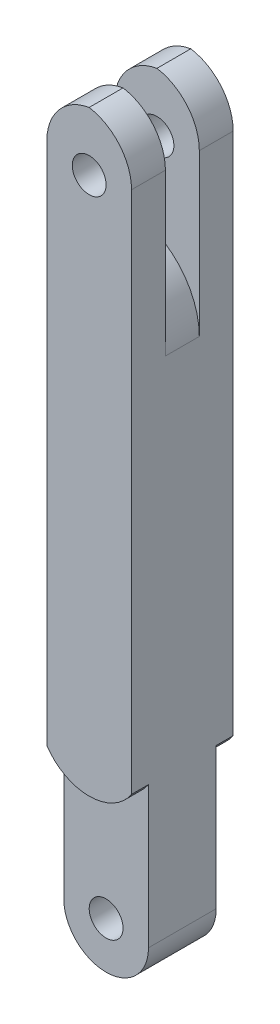
ISO-10303-21;
HEADER;
FILE_DESCRIPTION(('STEP AP214'),'2;1');
FILE_NAME('part.step','',(''),(''),'','','');
FILE_SCHEMA(('AUTOMOTIVE_DESIGN { 1 0 10303 214 1 1 1 1 }'));
ENDSEC;
DATA;
#1=APPLICATION_CONTEXT('core data for automotive mechanical design processes');
#2=APPLICATION_PROTOCOL_DEFINITION('international standard','automotive_design',2000,#1);
#3=PRODUCT_CONTEXT('',#1,'mechanical');
#4=PRODUCT('Part','Part','',(#3));
#5=PRODUCT_RELATED_PRODUCT_CATEGORY('part','',(#4));
#6=PRODUCT_DEFINITION_FORMATION('','',#4);
#7=PRODUCT_DEFINITION_CONTEXT('part definition',#1,'design');
#8=PRODUCT_DEFINITION('design','',#6,#7);
#9=PRODUCT_DEFINITION_SHAPE('','',#8);
#10=(LENGTH_UNIT() NAMED_UNIT(*) SI_UNIT(.MILLI.,.METRE.));
#11=(NAMED_UNIT(*) PLANE_ANGLE_UNIT() SI_UNIT($,.RADIAN.));
#12=(NAMED_UNIT(*) SI_UNIT($,.STERADIAN.) SOLID_ANGLE_UNIT());
#13=UNCERTAINTY_MEASURE_WITH_UNIT(LENGTH_MEASURE(1.E-05),#10,'distance_accuracy_value','');
#14=(GEOMETRIC_REPRESENTATION_CONTEXT(3) GLOBAL_UNCERTAINTY_ASSIGNED_CONTEXT((#13)) GLOBAL_UNIT_ASSIGNED_CONTEXT((#10,
#11,#12)) REPRESENTATION_CONTEXT('',''));
#15=CARTESIAN_POINT('',(0.,0.,0.));
#16=DIRECTION('',(0.,0.,1.));
#17=DIRECTION('',(1.,0.,0.));
#18=AXIS2_PLACEMENT_3D('',#15,#16,#17);
#19=CARTESIAN_POINT('',(-2.5,0.,6.));
#20=DIRECTION('',(-1.,0.,0.));
#21=DIRECTION('',(0.,0.,1.));
#22=AXIS2_PLACEMENT_3D('',#19,#20,#21);
#23=PLANE('',#22);
#24=DIRECTION('',(0.,1.,0.));
#25=VECTOR('',#24,1.);
#26=CARTESIAN_POINT('',(-2.5,0.,0.));
#27=LINE('',#26,#25);
#28=CARTESIAN_POINT('',(-2.5,8.0916876048223,0.));
#29=VERTEX_POINT('',#28);
#30=CARTESIAN_POINT('',(-2.5,39.,0.));
#31=VERTEX_POINT('',#30);
#32=EDGE_CURVE('E181',#29,#31,#27,.T.);
#33=ORIENTED_EDGE('',*,*,#32,.F.);
#34=DIRECTION('',(0.,0.,-1.));
#35=VECTOR('',#34,1.);
#36=CARTESIAN_POINT('',(-2.5,8.0916876048223,1.));
#37=LINE('',#36,#35);
#38=CARTESIAN_POINT('',(-2.5,8.0916876048223,1.));
#39=VERTEX_POINT('',#38);
#40=EDGE_CURVE('E51',#39,#29,#37,.T.);
#41=ORIENTED_EDGE('',*,*,#40,.F.);
#42=DIRECTION('',(0.,-1.,0.));
#43=VECTOR('',#42,1.);
#44=CARTESIAN_POINT('',(-2.5,8.0916876048223,1.));
#45=LINE('',#44,#43);
#46=CARTESIAN_POINT('',(-2.5,-0.25,1.));
#47=VERTEX_POINT('',#46);
#48=EDGE_CURVE('E146',#39,#47,#45,.T.);
#49=ORIENTED_EDGE('',*,*,#48,.T.);
#50=DIRECTION('',(0.,0.,-1.));
#51=VECTOR('',#50,1.);
#52=CARTESIAN_POINT('',(-2.5,-0.25,6.));
#53=LINE('',#52,#51);
#54=CARTESIAN_POINT('',(-2.5,-0.25,5.));
#55=VERTEX_POINT('',#54);
#56=EDGE_CURVE('E159',#55,#47,#53,.T.);
#57=ORIENTED_EDGE('',*,*,#56,.F.);
#58=DIRECTION('',(0.,-1.,0.));
#59=VECTOR('',#58,1.);
#60=CARTESIAN_POINT('',(-2.5,8.0916876048223,5.));
#61=LINE('',#60,#59);
#62=CARTESIAN_POINT('',(-2.5,8.0916876048223,5.));
#63=VERTEX_POINT('',#62);
#64=EDGE_CURVE('E238',#63,#55,#61,.T.);
#65=ORIENTED_EDGE('',*,*,#64,.F.);
#66=DIRECTION('',(0.,0.,1.));
#67=VECTOR('',#66,1.);
#68=CARTESIAN_POINT('',(-2.5,8.0916876048223,5.));
#69=LINE('',#68,#67);
#70=CARTESIAN_POINT('',(-2.5,8.0916876048223,6.));
#71=VERTEX_POINT('',#70);
#72=EDGE_CURVE('E232',#63,#71,#69,.T.);
#73=ORIENTED_EDGE('',*,*,#72,.T.);
#74=DIRECTION('',(0.,1.,0.));
#75=VECTOR('',#74,1.);
#76=CARTESIAN_POINT('',(-2.5,0.,6.));
#77=LINE('',#76,#75);
#78=CARTESIAN_POINT('',(-2.5,39.,6.));
#79=VERTEX_POINT('',#78);
#80=EDGE_CURVE('E254',#71,#79,#77,.T.);
#81=ORIENTED_EDGE('',*,*,#80,.T.);
#82=DIRECTION('',(0.,0.,-1.));
#83=VECTOR('',#82,1.);
#84=CARTESIAN_POINT('',(-2.5,39.,6.));
#85=LINE('',#84,#83);
#86=CARTESIAN_POINT('',(-2.5,39.,4.));
#87=VERTEX_POINT('',#86);
#88=EDGE_CURVE('E203',#79,#87,#85,.T.);
#89=ORIENTED_EDGE('',*,*,#88,.T.);
#90=DIRECTION('',(0.,1.,0.));
#91=VECTOR('',#90,1.);
#92=CARTESIAN_POINT('',(-2.5,34.,4.));
#93=LINE('',#92,#91);
#94=CARTESIAN_POINT('',(-2.5,29.5,4.));
#95=VERTEX_POINT('',#94);
#96=EDGE_CURVE('E199',#95,#87,#93,.T.);
#97=ORIENTED_EDGE('',*,*,#96,.F.);
#98=DIRECTION('',(0.,0.,1.));
#99=VECTOR('',#98,1.);
#100=CARTESIAN_POINT('',(-2.5,29.5,6.));
#101=LINE('',#100,#99);
#102=CARTESIAN_POINT('',(-2.5,29.5,2.));
#103=VERTEX_POINT('',#102);
#104=EDGE_CURVE('E165',#95,#103,#101,.F.);
#105=ORIENTED_EDGE('',*,*,#104,.T.);
#106=DIRECTION('',(0.,1.,0.));
#107=VECTOR('',#106,1.);
#108=CARTESIAN_POINT('',(-2.5,34.,2.));
#109=LINE('',#108,#107);
#110=CARTESIAN_POINT('',(-2.5,39.,2.));
#111=VERTEX_POINT('',#110);
#112=EDGE_CURVE('E179',#103,#111,#109,.T.);
#113=ORIENTED_EDGE('',*,*,#112,.T.);
#114=DIRECTION('',(0.,0.,-1.));
#115=VECTOR('',#114,1.);
#116=CARTESIAN_POINT('',(-2.5,39.,6.));
#117=LINE('',#116,#115);
#118=EDGE_CURVE('E195',#111,#31,#117,.T.);
#119=ORIENTED_EDGE('',*,*,#118,.T.);
#120=EDGE_LOOP('',(#33,#41,#49,#57,#65,#73,#81,#89,#97,#105,#113,#119));
#121=FACE_BOUND('',#120,.T.);
#122=ADVANCED_FACE('F34',(#121),#23,.T.);
#123=CARTESIAN_POINT('',(2.5,0.,6.));
#124=DIRECTION('',(-1.,0.,0.));
#125=DIRECTION('',(0.,0.,1.));
#126=AXIS2_PLACEMENT_3D('',#123,#124,#125);
#127=PLANE('',#126);
#128=DIRECTION('',(0.,0.,-1.));
#129=VECTOR('',#128,1.);
#130=CARTESIAN_POINT('',(2.5,8.0916876048223,1.));
#131=LINE('',#130,#129);
#132=CARTESIAN_POINT('',(2.5,8.0916876048223,1.));
#133=VERTEX_POINT('',#132);
#134=CARTESIAN_POINT('',(2.5,8.0916876048223,0.));
#135=VERTEX_POINT('',#134);
#136=EDGE_CURVE('E347',#133,#135,#131,.T.);
#137=ORIENTED_EDGE('',*,*,#136,.T.);
#138=DIRECTION('',(0.,1.,0.));
#139=VECTOR('',#138,1.);
#140=CARTESIAN_POINT('',(2.5,0.,0.));
#141=LINE('',#140,#139);
#142=CARTESIAN_POINT('',(2.5,39.,0.));
#143=VERTEX_POINT('',#142);
#144=EDGE_CURVE('E262',#135,#143,#141,.T.);
#145=ORIENTED_EDGE('',*,*,#144,.T.);
#146=DIRECTION('',(0.,0.,-1.));
#147=VECTOR('',#146,1.);
#148=CARTESIAN_POINT('',(2.5,39.,2.));
#149=LINE('',#148,#147);
#150=CARTESIAN_POINT('',(2.5,39.,2.));
#151=VERTEX_POINT('',#150);
#152=EDGE_CURVE('E11',#143,#151,#149,.F.);
#153=ORIENTED_EDGE('',*,*,#152,.T.);
#154=DIRECTION('',(0.,1.,0.));
#155=VECTOR('',#154,1.);
#156=CARTESIAN_POINT('',(2.5,34.,2.));
#157=LINE('',#156,#155);
#158=CARTESIAN_POINT('',(2.5,29.5,2.));
#159=VERTEX_POINT('',#158);
#160=EDGE_CURVE('E246',#159,#151,#157,.T.);
#161=ORIENTED_EDGE('',*,*,#160,.F.);
#162=DIRECTION('',(0.,0.,-1.));
#163=VECTOR('',#162,1.);
#164=CARTESIAN_POINT('',(2.5,29.5,4.));
#165=LINE('',#164,#163);
#166=CARTESIAN_POINT('',(2.5,29.5,4.));
#167=VERTEX_POINT('',#166);
#168=EDGE_CURVE('E169',#159,#167,#165,.F.);
#169=ORIENTED_EDGE('',*,*,#168,.T.);
#170=DIRECTION('',(0.,1.,0.));
#171=VECTOR('',#170,1.);
#172=CARTESIAN_POINT('',(2.5,34.,4.));
#173=LINE('',#172,#171);
#174=CARTESIAN_POINT('',(2.5,39.,4.));
#175=VERTEX_POINT('',#174);
#176=EDGE_CURVE('E249',#167,#175,#173,.T.);
#177=ORIENTED_EDGE('',*,*,#176,.T.);
#178=DIRECTION('',(0.,0.,-1.));
#179=VECTOR('',#178,1.);
#180=CARTESIAN_POINT('',(2.5,39.,6.));
#181=LINE('',#180,#179);
#182=CARTESIAN_POINT('',(2.5,39.,6.));
#183=VERTEX_POINT('',#182);
#184=EDGE_CURVE('E43',#175,#183,#181,.F.);
#185=ORIENTED_EDGE('',*,*,#184,.T.);
#186=DIRECTION('',(0.,1.,0.));
#187=VECTOR('',#186,1.);
#188=CARTESIAN_POINT('',(2.5,0.,6.));
#189=LINE('',#188,#187);
#190=CARTESIAN_POINT('',(2.5,8.0916876048223,6.));
#191=VERTEX_POINT('',#190);
#192=EDGE_CURVE('E256',#191,#183,#189,.T.);
#193=ORIENTED_EDGE('',*,*,#192,.F.);
#194=DIRECTION('',(0.,0.,1.));
#195=VECTOR('',#194,1.);
#196=CARTESIAN_POINT('',(2.5,8.0916876048223,5.));
#197=LINE('',#196,#195);
#198=CARTESIAN_POINT('',(2.5,8.0916876048223,5.));
#199=VERTEX_POINT('',#198);
#200=EDGE_CURVE('E59',#199,#191,#197,.T.);
#201=ORIENTED_EDGE('',*,*,#200,.F.);
#202=DIRECTION('',(0.,1.,0.));
#203=VECTOR('',#202,1.);
#204=CARTESIAN_POINT('',(2.5,8.0916876048223,5.));
#205=LINE('',#204,#203);
#206=CARTESIAN_POINT('',(2.5,-0.25,5.));
#207=VERTEX_POINT('',#206);
#208=EDGE_CURVE('E351',#207,#199,#205,.T.);
#209=ORIENTED_EDGE('',*,*,#208,.F.);
#210=DIRECTION('',(0.,0.,-1.));
#211=VECTOR('',#210,1.);
#212=CARTESIAN_POINT('',(2.5,-0.25,6.));
#213=LINE('',#212,#211);
#214=CARTESIAN_POINT('',(2.5,-0.25,1.));
#215=VERTEX_POINT('',#214);
#216=EDGE_CURVE('E166',#207,#215,#213,.T.);
#217=ORIENTED_EDGE('',*,*,#216,.T.);
#218=DIRECTION('',(0.,1.,0.));
#219=VECTOR('',#218,1.);
#220=CARTESIAN_POINT('',(2.5,8.0916876048223,1.));
#221=LINE('',#220,#219);
#222=EDGE_CURVE('E148',#215,#133,#221,.T.);
#223=ORIENTED_EDGE('',*,*,#222,.T.);
#224=EDGE_LOOP('',(#137,#145,#153,#161,#169,#177,#185,#193,#201,#209,#217,#223));
#225=FACE_BOUND('',#224,.T.);
#226=ADVANCED_FACE('F280',(#225),#127,.F.);
#227=CARTESIAN_POINT('',(0.,0.,0.));
#228=DIRECTION('',(0.,0.,1.));
#229=DIRECTION('',(1.,0.,0.));
#230=AXIS2_PLACEMENT_3D('',#227,#228,#229);
#231=PLANE('',#230);
#232=CARTESIAN_POINT('',(0.,38.5,0.));
#233=DIRECTION('',(0.,0.,1.));
#234=DIRECTION('',(1.,0.,0.));
#235=AXIS2_PLACEMENT_3D('',#232,#233,#234);
#236=CIRCLE('',#235,1.);
#237=CARTESIAN_POINT('',(1.,38.5,0.));
#238=VERTEX_POINT('',#237);
#239=EDGE_CURVE('E257',#238,#238,#236,.T.);
#240=ORIENTED_EDGE('',*,*,#239,.T.);
#241=EDGE_LOOP('',(#240));
#242=FACE_BOUND('',#241,.T.);
#243=CARTESIAN_POINT('',(0.,9.75,0.));
#244=DIRECTION('',(0.,0.,-1.));
#245=DIRECTION('',(-1.,0.,0.));
#246=AXIS2_PLACEMENT_3D('',#243,#244,#245);
#247=CIRCLE('',#246,3.);
#248=EDGE_CURVE('E153',#135,#29,#247,.T.);
#249=ORIENTED_EDGE('',*,*,#248,.T.);
#250=ORIENTED_EDGE('',*,*,#32,.T.);
#251=CARTESIAN_POINT('',(0.5,39.,0.));
#252=DIRECTION('',(0.,0.,1.));
#253=DIRECTION('',(1.,0.,0.));
#254=AXIS2_PLACEMENT_3D('',#251,#252,#253);
#255=CIRCLE('',#254,3.);
#256=CARTESIAN_POINT('',(0.,41.9580398915498,0.));
#257=VERTEX_POINT('',#256);
#258=EDGE_CURVE('E218',#31,#257,#255,.F.);
#259=ORIENTED_EDGE('',*,*,#258,.T.);
#260=CARTESIAN_POINT('',(-0.5,39.,0.));
#261=DIRECTION('',(0.,0.,1.));
#262=DIRECTION('',(1.,0.,0.));
#263=AXIS2_PLACEMENT_3D('',#260,#261,#262);
#264=CIRCLE('',#263,3.);
#265=EDGE_CURVE('E215',#257,#143,#264,.F.);
#266=ORIENTED_EDGE('',*,*,#265,.T.);
#267=ORIENTED_EDGE('',*,*,#144,.F.);
#268=EDGE_LOOP('',(#249,#250,#259,#266,#267));
#269=FACE_BOUND('',#268,.T.);
#270=ADVANCED_FACE('F266',(#242,#269),#231,.F.);
#271=CARTESIAN_POINT('',(0.,38.5,6.));
#272=DIRECTION('',(0.,0.,-1.));
#273=DIRECTION('',(-1.,0.,0.));
#274=AXIS2_PLACEMENT_3D('',#271,#272,#273);
#275=CYLINDRICAL_SURFACE('',#274,1.);
#276=CARTESIAN_POINT('',(0.,38.5,2.));
#277=DIRECTION('',(0.,0.,-1.));
#278=DIRECTION('',(-1.,0.,0.));
#279=AXIS2_PLACEMENT_3D('',#276,#277,#278);
#280=CIRCLE('',#279,1.);
#281=CARTESIAN_POINT('',(-1.,38.5,2.));
#282=VERTEX_POINT('',#281);
#283=EDGE_CURVE('E178',#282,#282,#280,.T.);
#284=ORIENTED_EDGE('',*,*,#283,.F.);
#285=EDGE_LOOP('',(#284));
#286=FACE_BOUND('',#285,.T.);
#287=ORIENTED_EDGE('',*,*,#239,.F.);
#288=EDGE_LOOP('',(#287));
#289=FACE_BOUND('',#288,.T.);
#290=ADVANCED_FACE('F269',(#286,#289),#275,.F.);
#291=CARTESIAN_POINT('',(0.,-0.25,6.));
#292=DIRECTION('',(0.,0.,-1.));
#293=DIRECTION('',(-1.,0.,0.));
#294=AXIS2_PLACEMENT_3D('',#291,#292,#293);
#295=CYLINDRICAL_SURFACE('',#294,2.5);
#296=ORIENTED_EDGE('',*,*,#56,.T.);
#297=CARTESIAN_POINT('',(0.,-0.25,1.));
#298=DIRECTION('',(0.,0.,1.));
#299=DIRECTION('',(-1.,0.,0.));
#300=AXIS2_PLACEMENT_3D('',#297,#298,#299);
#301=CIRCLE('',#300,2.5);
#302=EDGE_CURVE('E142',#47,#215,#301,.T.);
#303=ORIENTED_EDGE('',*,*,#302,.T.);
#304=ORIENTED_EDGE('',*,*,#216,.F.);
#305=CARTESIAN_POINT('',(0.,-0.25,5.));
#306=DIRECTION('',(0.,0.,1.));
#307=DIRECTION('',(-1.,0.,0.));
#308=AXIS2_PLACEMENT_3D('',#305,#306,#307);
#309=CIRCLE('',#308,2.5);
#310=EDGE_CURVE('E164',#55,#207,#309,.T.);
#311=ORIENTED_EDGE('',*,*,#310,.F.);
#312=EDGE_LOOP('',(#296,#303,#304,#311));
#313=FACE_BOUND('',#312,.T.);
#314=ADVANCED_FACE('F163',(#313),#295,.T.);
#315=CARTESIAN_POINT('',(0.,0.,6.));
#316=DIRECTION('',(0.,0.,-1.));
#317=DIRECTION('',(-1.,0.,0.));
#318=AXIS2_PLACEMENT_3D('',#315,#316,#317);
#319=CYLINDRICAL_SURFACE('',#318,1.);
#320=CARTESIAN_POINT('',(0.,0.,1.));
#321=DIRECTION('',(0.,0.,1.));
#322=DIRECTION('',(1.,0.,0.));
#323=AXIS2_PLACEMENT_3D('',#320,#321,#322);
#324=CIRCLE('',#323,1.);
#325=CARTESIAN_POINT('',(1.,0.,1.));
#326=VERTEX_POINT('',#325);
#327=EDGE_CURVE('E38',#326,#326,#324,.T.);
#328=ORIENTED_EDGE('',*,*,#327,.F.);
#329=EDGE_LOOP('',(#328));
#330=FACE_BOUND('',#329,.T.);
#331=CARTESIAN_POINT('',(0.,0.,5.));
#332=DIRECTION('',(0.,0.,-1.));
#333=DIRECTION('',(-1.,0.,0.));
#334=AXIS2_PLACEMENT_3D('',#331,#332,#333);
#335=CIRCLE('',#334,1.);
#336=CARTESIAN_POINT('',(-1.,0.,5.));
#337=VERTEX_POINT('',#336);
#338=EDGE_CURVE('E230',#337,#337,#335,.T.);
#339=ORIENTED_EDGE('',*,*,#338,.F.);
#340=EDGE_LOOP('',(#339));
#341=FACE_BOUND('',#340,.T.);
#342=ADVANCED_FACE('F278',(#330,#341),#319,.F.);
#343=CARTESIAN_POINT('',(0.,38.5,4.));
#344=DIRECTION('',(0.,0.,1.));
#345=DIRECTION('',(1.,0.,0.));
#346=AXIS2_PLACEMENT_3D('',#343,#344,#345);
#347=CIRCLE('',#346,1.);
#348=CARTESIAN_POINT('',(1.,38.5,4.));
#349=VERTEX_POINT('',#348);
#350=EDGE_CURVE('E175',#349,#349,#347,.T.);
#351=ORIENTED_EDGE('',*,*,#350,.F.);
#352=EDGE_LOOP('',(#351));
#353=FACE_BOUND('',#352,.T.);
#354=CARTESIAN_POINT('',(0.,38.5,6.));
#355=DIRECTION('',(0.,0.,1.));
#356=DIRECTION('',(1.,0.,0.));
#357=AXIS2_PLACEMENT_3D('',#354,#355,#356);
#358=CIRCLE('',#357,1.);
#359=CARTESIAN_POINT('',(1.,38.5,6.));
#360=VERTEX_POINT('',#359);
#361=EDGE_CURVE('E171',#360,#360,#358,.T.);
#362=ORIENTED_EDGE('',*,*,#361,.T.);
#363=EDGE_LOOP('',(#362));
#364=FACE_BOUND('',#363,.T.);
#365=ADVANCED_FACE('F273',(#353,#364),#275,.F.);
#366=CARTESIAN_POINT('',(0.,0.,6.));
#367=DIRECTION('',(0.,0.,1.));
#368=DIRECTION('',(1.,0.,0.));
#369=AXIS2_PLACEMENT_3D('',#366,#367,#368);
#370=PLANE('',#369);
#371=CARTESIAN_POINT('',(0.,9.75,6.));
#372=DIRECTION('',(0.,0.,-1.));
#373=DIRECTION('',(-1.,0.,0.));
#374=AXIS2_PLACEMENT_3D('',#371,#372,#373);
#375=CIRCLE('',#374,3.);
#376=EDGE_CURVE('E241',#191,#71,#375,.T.);
#377=ORIENTED_EDGE('',*,*,#376,.F.);
#378=ORIENTED_EDGE('',*,*,#192,.T.);
#379=CARTESIAN_POINT('',(-0.5,39.,6.));
#380=DIRECTION('',(0.,0.,1.));
#381=DIRECTION('',(1.,0.,0.));
#382=AXIS2_PLACEMENT_3D('',#379,#380,#381);
#383=CIRCLE('',#382,3.);
#384=CARTESIAN_POINT('',(0.,41.9580398915498,6.));
#385=VERTEX_POINT('',#384);
#386=EDGE_CURVE('E210',#183,#385,#383,.T.);
#387=ORIENTED_EDGE('',*,*,#386,.T.);
#388=CARTESIAN_POINT('',(0.5,39.,6.));
#389=DIRECTION('',(0.,0.,1.));
#390=DIRECTION('',(1.,0.,0.));
#391=AXIS2_PLACEMENT_3D('',#388,#389,#390);
#392=CIRCLE('',#391,3.);
#393=EDGE_CURVE('E212',#385,#79,#392,.T.);
#394=ORIENTED_EDGE('',*,*,#393,.T.);
#395=ORIENTED_EDGE('',*,*,#80,.F.);
#396=EDGE_LOOP('',(#377,#378,#387,#394,#395));
#397=FACE_BOUND('',#396,.T.);
#398=ORIENTED_EDGE('',*,*,#361,.F.);
#399=EDGE_LOOP('',(#398));
#400=FACE_BOUND('',#399,.T.);
#401=ADVANCED_FACE('F285',(#397,#400),#370,.T.);
#402=CARTESIAN_POINT('',(-2.5,34.,2.));
#403=DIRECTION('',(0.,0.,-1.));
#404=DIRECTION('',(-1.,0.,0.));
#405=AXIS2_PLACEMENT_3D('',#402,#403,#404);
#406=PLANE('',#405);
#407=ORIENTED_EDGE('',*,*,#283,.T.);
#408=EDGE_LOOP('',(#407));
#409=FACE_BOUND('',#408,.T.);
#410=CARTESIAN_POINT('',(-0.5,39.,2.));
#411=DIRECTION('',(0.,0.,-1.));
#412=DIRECTION('',(-1.,0.,0.));
#413=AXIS2_PLACEMENT_3D('',#410,#411,#412);
#414=CIRCLE('',#413,3.);
#415=CARTESIAN_POINT('',(0.,41.9580398915498,2.));
#416=VERTEX_POINT('',#415);
#417=EDGE_CURVE('E220',#151,#416,#414,.F.);
#418=ORIENTED_EDGE('',*,*,#417,.T.);
#419=CARTESIAN_POINT('',(0.5,39.,2.));
#420=DIRECTION('',(0.,0.,-1.));
#421=DIRECTION('',(-1.,0.,0.));
#422=AXIS2_PLACEMENT_3D('',#419,#420,#421);
#423=CIRCLE('',#422,3.);
#424=EDGE_CURVE('E222',#416,#111,#423,.F.);
#425=ORIENTED_EDGE('',*,*,#424,.T.);
#426=ORIENTED_EDGE('',*,*,#112,.F.);
#427=CARTESIAN_POINT('',(2.,29.5,2.));
#428=DIRECTION('',(0.,0.,-1.));
#429=DIRECTION('',(-1.,0.,0.));
#430=AXIS2_PLACEMENT_3D('',#427,#428,#429);
#431=CIRCLE('',#430,4.5);
#432=CARTESIAN_POINT('',(0.,33.5311288741493,2.));
#433=VERTEX_POINT('',#432);
#434=EDGE_CURVE('E188',#103,#433,#431,.T.);
#435=ORIENTED_EDGE('',*,*,#434,.T.);
#436=CARTESIAN_POINT('',(-2.,29.5,2.));
#437=DIRECTION('',(0.,0.,-1.));
#438=DIRECTION('',(-1.,0.,0.));
#439=AXIS2_PLACEMENT_3D('',#436,#437,#438);
#440=CIRCLE('',#439,4.5);
#441=EDGE_CURVE('E190',#433,#159,#440,.T.);
#442=ORIENTED_EDGE('',*,*,#441,.T.);
#443=ORIENTED_EDGE('',*,*,#160,.T.);
#444=EDGE_LOOP('',(#418,#425,#426,#435,#442,#443));
#445=FACE_BOUND('',#444,.T.);
#446=ADVANCED_FACE('F329',(#409,#445),#406,.F.);
#447=CARTESIAN_POINT('',(-2.5,34.,4.));
#448=DIRECTION('',(0.,0.,1.));
#449=DIRECTION('',(1.,0.,0.));
#450=AXIS2_PLACEMENT_3D('',#447,#448,#449);
#451=PLANE('',#450);
#452=ORIENTED_EDGE('',*,*,#350,.T.);
#453=EDGE_LOOP('',(#452));
#454=FACE_BOUND('',#453,.T.);
#455=ORIENTED_EDGE('',*,*,#96,.T.);
#456=CARTESIAN_POINT('',(0.5,39.,4.));
#457=DIRECTION('',(0.,0.,1.));
#458=DIRECTION('',(1.,0.,0.));
#459=AXIS2_PLACEMENT_3D('',#456,#457,#458);
#460=CIRCLE('',#459,3.);
#461=CARTESIAN_POINT('',(0.,41.9580398915498,4.));
#462=VERTEX_POINT('',#461);
#463=EDGE_CURVE('E208',#87,#462,#460,.F.);
#464=ORIENTED_EDGE('',*,*,#463,.T.);
#465=CARTESIAN_POINT('',(-0.5,39.,4.));
#466=DIRECTION('',(0.,0.,1.));
#467=DIRECTION('',(1.,0.,0.));
#468=AXIS2_PLACEMENT_3D('',#465,#466,#467);
#469=CIRCLE('',#468,3.);
#470=EDGE_CURVE('E206',#462,#175,#469,.F.);
#471=ORIENTED_EDGE('',*,*,#470,.T.);
#472=ORIENTED_EDGE('',*,*,#176,.F.);
#473=CARTESIAN_POINT('',(-2.,29.5,4.));
#474=DIRECTION('',(0.,0.,1.));
#475=DIRECTION('',(1.,0.,0.));
#476=AXIS2_PLACEMENT_3D('',#473,#474,#475);
#477=CIRCLE('',#476,4.5);
#478=CARTESIAN_POINT('',(0.,33.5311288741493,4.));
#479=VERTEX_POINT('',#478);
#480=EDGE_CURVE('E193',#167,#479,#477,.T.);
#481=ORIENTED_EDGE('',*,*,#480,.T.);
#482=CARTESIAN_POINT('',(2.,29.5,4.));
#483=DIRECTION('',(0.,0.,1.));
#484=DIRECTION('',(1.,0.,0.));
#485=AXIS2_PLACEMENT_3D('',#482,#483,#484);
#486=CIRCLE('',#485,4.5);
#487=EDGE_CURVE('E185',#479,#95,#486,.T.);
#488=ORIENTED_EDGE('',*,*,#487,.T.);
#489=EDGE_LOOP('',(#455,#464,#471,#472,#481,#488));
#490=FACE_BOUND('',#489,.T.);
#491=ADVANCED_FACE('F305',(#454,#490),#451,.F.);
#492=CARTESIAN_POINT('',(-2.,29.5,0.));
#493=DIRECTION('',(0.,0.,1.));
#494=DIRECTION('',(1.,0.,0.));
#495=AXIS2_PLACEMENT_3D('',#492,#493,#494);
#496=CYLINDRICAL_SURFACE('',#495,4.5);
#497=ORIENTED_EDGE('',*,*,#168,.F.);
#498=ORIENTED_EDGE('',*,*,#441,.F.);
#499=DIRECTION('',(0.,0.,1.));
#500=VECTOR('',#499,1.);
#501=CARTESIAN_POINT('',(0.,33.5311288741493,3.));
#502=LINE('',#501,#500);
#503=EDGE_CURVE('E196',#479,#433,#502,.F.);
#504=ORIENTED_EDGE('',*,*,#503,.F.);
#505=ORIENTED_EDGE('',*,*,#480,.F.);
#506=EDGE_LOOP('',(#497,#498,#504,#505));
#507=FACE_BOUND('',#506,.T.);
#508=ADVANCED_FACE('F301',(#507),#496,.T.);
#509=CARTESIAN_POINT('',(2.,29.5,0.));
#510=DIRECTION('',(0.,0.,1.));
#511=DIRECTION('',(1.,0.,0.));
#512=AXIS2_PLACEMENT_3D('',#509,#510,#511);
#513=CYLINDRICAL_SURFACE('',#512,4.5);
#514=ORIENTED_EDGE('',*,*,#434,.F.);
#515=ORIENTED_EDGE('',*,*,#104,.F.);
#516=ORIENTED_EDGE('',*,*,#487,.F.);
#517=ORIENTED_EDGE('',*,*,#503,.T.);
#518=EDGE_LOOP('',(#514,#515,#516,#517));
#519=FACE_BOUND('',#518,.T.);
#520=ADVANCED_FACE('F297',(#519),#513,.T.);
#521=CARTESIAN_POINT('',(-0.5,39.,6.));
#522=DIRECTION('',(0.,0.,1.));
#523=DIRECTION('',(1.,0.,0.));
#524=AXIS2_PLACEMENT_3D('',#521,#522,#523);
#525=CYLINDRICAL_SURFACE('',#524,3.);
#526=DIRECTION('',(0.,0.,1.));
#527=VECTOR('',#526,1.);
#528=CARTESIAN_POINT('',(0.,41.9580398915498,5.));
#529=LINE('',#528,#527);
#530=EDGE_CURVE('E200',#385,#462,#529,.F.);
#531=ORIENTED_EDGE('',*,*,#530,.F.);
#532=ORIENTED_EDGE('',*,*,#386,.F.);
#533=ORIENTED_EDGE('',*,*,#184,.F.);
#534=ORIENTED_EDGE('',*,*,#470,.F.);
#535=EDGE_LOOP('',(#531,#532,#533,#534));
#536=FACE_BOUND('',#535,.T.);
#537=ADVANCED_FACE('F300',(#536),#525,.T.);
#538=CARTESIAN_POINT('',(0.5,39.,6.));
#539=DIRECTION('',(0.,0.,-1.));
#540=DIRECTION('',(-1.,0.,0.));
#541=AXIS2_PLACEMENT_3D('',#538,#539,#540);
#542=CYLINDRICAL_SURFACE('',#541,3.);
#543=ORIENTED_EDGE('',*,*,#393,.F.);
#544=ORIENTED_EDGE('',*,*,#530,.T.);
#545=ORIENTED_EDGE('',*,*,#463,.F.);
#546=ORIENTED_EDGE('',*,*,#88,.F.);
#547=EDGE_LOOP('',(#543,#544,#545,#546));
#548=FACE_BOUND('',#547,.T.);
#549=ADVANCED_FACE('F307',(#548),#542,.T.);
#550=CARTESIAN_POINT('',(-0.5,39.,6.));
#551=DIRECTION('',(0.,0.,1.));
#552=DIRECTION('',(1.,0.,0.));
#553=AXIS2_PLACEMENT_3D('',#550,#551,#552);
#554=CYLINDRICAL_SURFACE('',#553,3.);
#555=DIRECTION('',(0.,0.,1.));
#556=VECTOR('',#555,1.);
#557=CARTESIAN_POINT('',(0.,41.9580398915498,1.));
#558=LINE('',#557,#556);
#559=EDGE_CURVE('E228',#416,#257,#558,.F.);
#560=ORIENTED_EDGE('',*,*,#559,.F.);
#561=ORIENTED_EDGE('',*,*,#417,.F.);
#562=ORIENTED_EDGE('',*,*,#152,.F.);
#563=ORIENTED_EDGE('',*,*,#265,.F.);
#564=EDGE_LOOP('',(#560,#561,#562,#563));
#565=FACE_BOUND('',#564,.T.);
#566=ADVANCED_FACE('F36',(#565),#554,.T.);
#567=CARTESIAN_POINT('',(0.5,39.,6.));
#568=DIRECTION('',(0.,0.,-1.));
#569=DIRECTION('',(-1.,0.,0.));
#570=AXIS2_PLACEMENT_3D('',#567,#568,#569);
#571=CYLINDRICAL_SURFACE('',#570,3.);
#572=ORIENTED_EDGE('',*,*,#424,.F.);
#573=ORIENTED_EDGE('',*,*,#559,.T.);
#574=ORIENTED_EDGE('',*,*,#258,.F.);
#575=ORIENTED_EDGE('',*,*,#118,.F.);
#576=EDGE_LOOP('',(#572,#573,#574,#575));
#577=FACE_BOUND('',#576,.T.);
#578=ADVANCED_FACE('F313',(#577),#571,.T.);
#579=CARTESIAN_POINT('',(0.,9.75,5.));
#580=DIRECTION('',(0.,0.,1.));
#581=DIRECTION('',(1.,0.,0.));
#582=AXIS2_PLACEMENT_3D('',#579,#580,#581);
#583=CYLINDRICAL_SURFACE('',#582,3.);
#584=ORIENTED_EDGE('',*,*,#376,.T.);
#585=ORIENTED_EDGE('',*,*,#72,.F.);
#586=CARTESIAN_POINT('',(0.,9.75,5.));
#587=DIRECTION('',(0.,0.,-1.));
#588=DIRECTION('',(-1.,0.,0.));
#589=AXIS2_PLACEMENT_3D('',#586,#587,#588);
#590=CIRCLE('',#589,3.);
#591=EDGE_CURVE('E354',#199,#63,#590,.T.);
#592=ORIENTED_EDGE('',*,*,#591,.F.);
#593=ORIENTED_EDGE('',*,*,#200,.T.);
#594=EDGE_LOOP('',(#584,#585,#592,#593));
#595=FACE_BOUND('',#594,.T.);
#596=ADVANCED_FACE('F315',(#595),#583,.T.);
#597=CARTESIAN_POINT('',(0.,-0.25,5.));
#598=DIRECTION('',(0.,0.,-1.));
#599=DIRECTION('',(-1.,0.,0.));
#600=AXIS2_PLACEMENT_3D('',#597,#598,#599);
#601=PLANE('',#600);
#602=ORIENTED_EDGE('',*,*,#338,.T.);
#603=EDGE_LOOP('',(#602));
#604=FACE_BOUND('',#603,.T.);
#605=ORIENTED_EDGE('',*,*,#310,.T.);
#606=ORIENTED_EDGE('',*,*,#208,.T.);
#607=ORIENTED_EDGE('',*,*,#591,.T.);
#608=ORIENTED_EDGE('',*,*,#64,.T.);
#609=EDGE_LOOP('',(#605,#606,#607,#608));
#610=FACE_BOUND('',#609,.T.);
#611=ADVANCED_FACE('F321',(#604,#610),#601,.F.);
#612=CARTESIAN_POINT('',(0.,9.75,1.));
#613=DIRECTION('',(0.,0.,-1.));
#614=DIRECTION('',(-1.,0.,0.));
#615=AXIS2_PLACEMENT_3D('',#612,#613,#614);
#616=CYLINDRICAL_SURFACE('',#615,3.);
#617=ORIENTED_EDGE('',*,*,#248,.F.);
#618=ORIENTED_EDGE('',*,*,#136,.F.);
#619=CARTESIAN_POINT('',(0.,9.75,1.));
#620=DIRECTION('',(0.,0.,-1.));
#621=DIRECTION('',(-1.,0.,0.));
#622=AXIS2_PLACEMENT_3D('',#619,#620,#621);
#623=CIRCLE('',#622,3.);
#624=EDGE_CURVE('E160',#133,#39,#623,.T.);
#625=ORIENTED_EDGE('',*,*,#624,.T.);
#626=ORIENTED_EDGE('',*,*,#40,.T.);
#627=EDGE_LOOP('',(#617,#618,#625,#626));
#628=FACE_BOUND('',#627,.T.);
#629=ADVANCED_FACE('F365',(#628),#616,.T.);
#630=CARTESIAN_POINT('',(0.,-0.25,1.));
#631=DIRECTION('',(0.,0.,1.));
#632=DIRECTION('',(-1.,0.,0.));
#633=AXIS2_PLACEMENT_3D('',#630,#631,#632);
#634=PLANE('',#633);
#635=ORIENTED_EDGE('',*,*,#327,.T.);
#636=EDGE_LOOP('',(#635));
#637=FACE_BOUND('',#636,.T.);
#638=ORIENTED_EDGE('',*,*,#302,.F.);
#639=ORIENTED_EDGE('',*,*,#48,.F.);
#640=ORIENTED_EDGE('',*,*,#624,.F.);
#641=ORIENTED_EDGE('',*,*,#222,.F.);
#642=EDGE_LOOP('',(#638,#639,#640,#641));
#643=FACE_BOUND('',#642,.T.);
#644=ADVANCED_FACE('F144',(#637,#643),#634,.F.);
#645=CLOSED_SHELL('',(#122,#226,#270,#290,#314,#342,#365,#401,#446,#491,#508,#520,#537,#549,
#566,#578,#596,#611,#629,#644));
#646=MANIFOLD_SOLID_BREP('B2',#645);
#647=ADVANCED_BREP_SHAPE_REPRESENTATION('',(#18,#646),#14);
#648=SHAPE_DEFINITION_REPRESENTATION(#9,#647);
ENDSEC;
END-ISO-10303-21;
